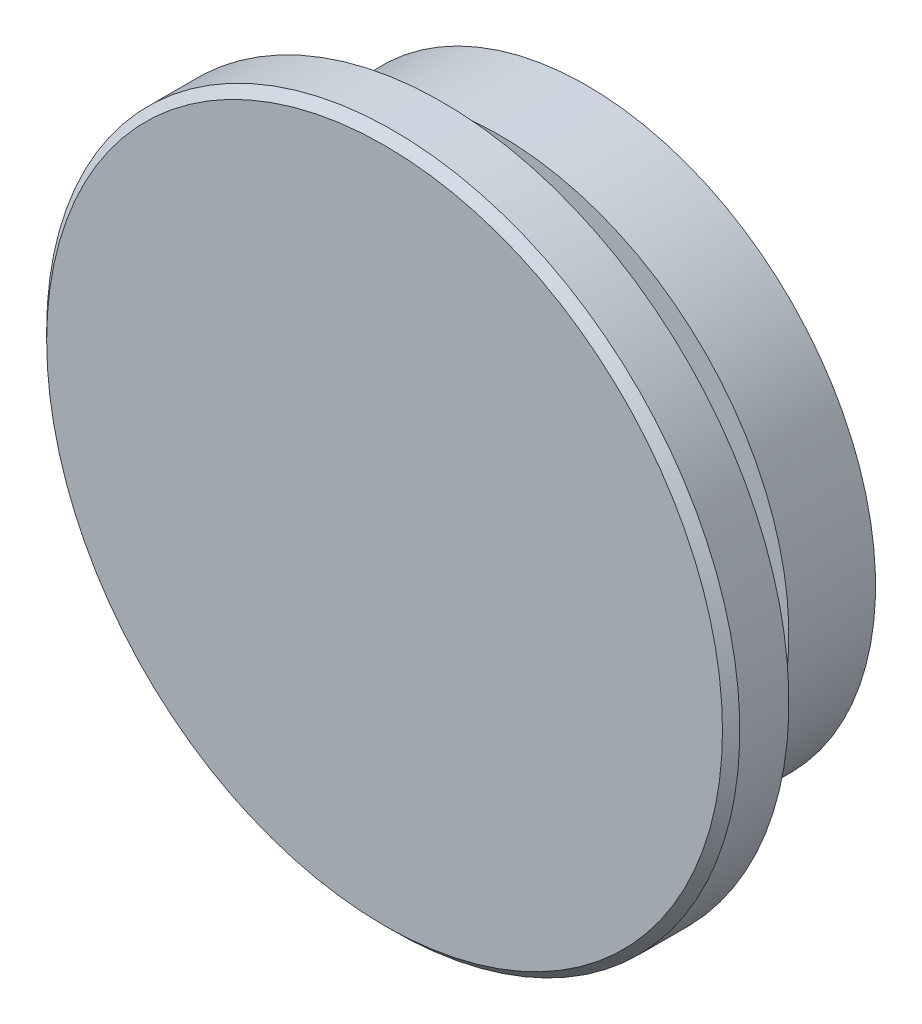
ISO-10303-21;
HEADER;
FILE_DESCRIPTION(('STEP AP214'),'2;1');
FILE_NAME('part.step','',(''),(''),'','','');
FILE_SCHEMA(('AUTOMOTIVE_DESIGN { 1 0 10303 214 1 1 1 1 }'));
ENDSEC;
DATA;
#1=APPLICATION_CONTEXT('core data for automotive mechanical design processes');
#2=APPLICATION_PROTOCOL_DEFINITION('international standard','automotive_design',2000,#1);
#3=PRODUCT_CONTEXT('',#1,'mechanical');
#4=PRODUCT('Part','Part','',(#3));
#5=PRODUCT_RELATED_PRODUCT_CATEGORY('part','',(#4));
#6=PRODUCT_DEFINITION_FORMATION('','',#4);
#7=PRODUCT_DEFINITION_CONTEXT('part definition',#1,'design');
#8=PRODUCT_DEFINITION('design','',#6,#7);
#9=PRODUCT_DEFINITION_SHAPE('','',#8);
#10=(LENGTH_UNIT() NAMED_UNIT(*) SI_UNIT(.MILLI.,.METRE.));
#11=(NAMED_UNIT(*) PLANE_ANGLE_UNIT() SI_UNIT($,.RADIAN.));
#12=(NAMED_UNIT(*) SI_UNIT($,.STERADIAN.) SOLID_ANGLE_UNIT());
#13=UNCERTAINTY_MEASURE_WITH_UNIT(LENGTH_MEASURE(1.E-05),#10,'distance_accuracy_value','');
#14=(GEOMETRIC_REPRESENTATION_CONTEXT(3) GLOBAL_UNCERTAINTY_ASSIGNED_CONTEXT((#13)) GLOBAL_UNIT_ASSIGNED_CONTEXT((#10,
#11,#12)) REPRESENTATION_CONTEXT('',''));
#15=CARTESIAN_POINT('',(0.,0.,0.));
#16=DIRECTION('',(0.,0.,1.));
#17=DIRECTION('',(1.,0.,0.));
#18=AXIS2_PLACEMENT_3D('',#15,#16,#17);
#19=CARTESIAN_POINT('',(0.,0.,0.));
#20=DIRECTION('',(0.,0.,1.));
#21=DIRECTION('',(1.,0.,0.));
#22=AXIS2_PLACEMENT_3D('',#19,#20,#21);
#23=PLANE('',#22);
#24=CARTESIAN_POINT('',(0.,0.,0.));
#25=DIRECTION('',(0.,0.,-1.));
#26=DIRECTION('',(-1.,0.,0.));
#27=AXIS2_PLACEMENT_3D('',#24,#25,#26);
#28=CIRCLE('',#27,11.7);
#29=CARTESIAN_POINT('',(-11.7,0.,0.));
#30=VERTEX_POINT('',#29);
#31=EDGE_CURVE('E10',#30,#30,#28,.T.);
#32=ORIENTED_EDGE('',*,*,#31,.F.);
#33=EDGE_LOOP('',(#32));
#34=FACE_BOUND('',#33,.T.);
#35=ADVANCED_FACE('F30',(#34),#23,.T.);
#36=CARTESIAN_POINT('',(0.,0.,-0.299999999999998));
#37=DIRECTION('',(0.,0.,-1.));
#38=DIRECTION('',(-1.,0.,0.));
#39=AXIS2_PLACEMENT_3D('',#36,#37,#38);
#40=CONICAL_SURFACE('',#39,12.,0.785398163397448);
#41=ORIENTED_EDGE('',*,*,#31,.T.);
#42=EDGE_LOOP('',(#41));
#43=FACE_BOUND('',#42,.T.);
#44=CARTESIAN_POINT('',(0.,0.,-0.299999999999998));
#45=DIRECTION('',(0.,0.,-1.));
#46=DIRECTION('',(-1.,0.,0.));
#47=AXIS2_PLACEMENT_3D('',#44,#45,#46);
#48=CIRCLE('',#47,12.);
#49=CARTESIAN_POINT('',(-12.,0.,-0.299999999999998));
#50=VERTEX_POINT('',#49);
#51=EDGE_CURVE('E36',#50,#50,#48,.T.);
#52=ORIENTED_EDGE('',*,*,#51,.F.);
#53=EDGE_LOOP('',(#52));
#54=FACE_BOUND('',#53,.T.);
#55=ADVANCED_FACE('F81',(#43,#54),#40,.T.);
#56=CARTESIAN_POINT('',(0.,0.,-5.5));
#57=DIRECTION('',(0.,0.,-1.));
#58=DIRECTION('',(-1.,0.,0.));
#59=AXIS2_PLACEMENT_3D('',#56,#57,#58);
#60=CYLINDRICAL_SURFACE('',#59,12.);
#61=ORIENTED_EDGE('',*,*,#51,.T.);
#62=EDGE_LOOP('',(#61));
#63=FACE_BOUND('',#62,.T.);
#64=CARTESIAN_POINT('',(0.,0.,-2.));
#65=DIRECTION('',(0.,0.,-1.));
#66=DIRECTION('',(-1.,0.,0.));
#67=AXIS2_PLACEMENT_3D('',#64,#65,#66);
#68=CIRCLE('',#67,12.);
#69=CARTESIAN_POINT('',(-12.,0.,-2.));
#70=VERTEX_POINT('',#69);
#71=EDGE_CURVE('E40',#70,#70,#68,.T.);
#72=ORIENTED_EDGE('',*,*,#71,.F.);
#73=EDGE_LOOP('',(#72));
#74=FACE_BOUND('',#73,.T.);
#75=ADVANCED_FACE('F86',(#63,#74),#60,.T.);
#76=CARTESIAN_POINT('',(-12.,0.,-2.));
#77=DIRECTION('',(0.,0.,-1.));
#78=DIRECTION('',(-1.,0.,0.));
#79=AXIS2_PLACEMENT_3D('',#76,#77,#78);
#80=PLANE('',#79);
#81=ORIENTED_EDGE('',*,*,#71,.T.);
#82=EDGE_LOOP('',(#81));
#83=FACE_BOUND('',#82,.T.);
#84=CARTESIAN_POINT('',(0.,0.,-2.));
#85=DIRECTION('',(0.,0.,-1.));
#86=DIRECTION('',(-1.,0.,0.));
#87=AXIS2_PLACEMENT_3D('',#84,#85,#86);
#88=CIRCLE('',#87,9.);
#89=CARTESIAN_POINT('',(-9.,0.,-2.));
#90=VERTEX_POINT('',#89);
#91=EDGE_CURVE('E44',#90,#90,#88,.T.);
#92=ORIENTED_EDGE('',*,*,#91,.F.);
#93=EDGE_LOOP('',(#92));
#94=FACE_BOUND('',#93,.T.);
#95=ADVANCED_FACE('F90',(#83,#94),#80,.T.);
#96=CARTESIAN_POINT('',(0.,0.,-5.5));
#97=DIRECTION('',(0.,0.,-1.));
#98=DIRECTION('',(-1.,0.,0.));
#99=AXIS2_PLACEMENT_3D('',#96,#97,#98);
#100=CYLINDRICAL_SURFACE('',#99,9.);
#101=ORIENTED_EDGE('',*,*,#91,.T.);
#102=EDGE_LOOP('',(#101));
#103=FACE_BOUND('',#102,.T.);
#104=CARTESIAN_POINT('',(0.,0.,-4.));
#105=DIRECTION('',(0.,0.,-1.));
#106=DIRECTION('',(-1.,0.,0.));
#107=AXIS2_PLACEMENT_3D('',#104,#105,#106);
#108=CIRCLE('',#107,9.);
#109=CARTESIAN_POINT('',(-9.,0.,-4.));
#110=VERTEX_POINT('',#109);
#111=EDGE_CURVE('E49',#110,#110,#108,.T.);
#112=ORIENTED_EDGE('',*,*,#111,.F.);
#113=EDGE_LOOP('',(#112));
#114=FACE_BOUND('',#113,.T.);
#115=ADVANCED_FACE('F96',(#103,#114),#100,.T.);
#116=CARTESIAN_POINT('',(-9.,0.,-4.));
#117=DIRECTION('',(0.,0.,1.));
#118=DIRECTION('',(1.,0.,0.));
#119=AXIS2_PLACEMENT_3D('',#116,#117,#118);
#120=PLANE('',#119);
#121=ORIENTED_EDGE('',*,*,#111,.T.);
#122=EDGE_LOOP('',(#121));
#123=FACE_BOUND('',#122,.T.);
#124=CARTESIAN_POINT('',(0.,0.,-4.));
#125=DIRECTION('',(0.,0.,-1.));
#126=DIRECTION('',(-1.,0.,0.));
#127=AXIS2_PLACEMENT_3D('',#124,#125,#126);
#128=CIRCLE('',#127,10.);
#129=CARTESIAN_POINT('',(-10.,0.,-4.));
#130=VERTEX_POINT('',#129);
#131=EDGE_CURVE('E52',#130,#130,#128,.T.);
#132=ORIENTED_EDGE('',*,*,#131,.F.);
#133=EDGE_LOOP('',(#132));
#134=FACE_BOUND('',#133,.T.);
#135=ADVANCED_FACE('F100',(#123,#134),#120,.T.);
#136=CARTESIAN_POINT('',(0.,0.,-5.5));
#137=DIRECTION('',(0.,0.,-1.));
#138=DIRECTION('',(-1.,0.,0.));
#139=AXIS2_PLACEMENT_3D('',#136,#137,#138);
#140=CYLINDRICAL_SURFACE('',#139,10.);
#141=ORIENTED_EDGE('',*,*,#131,.T.);
#142=EDGE_LOOP('',(#141));
#143=FACE_BOUND('',#142,.T.);
#144=CARTESIAN_POINT('',(0.,0.,-7.));
#145=DIRECTION('',(0.,0.,-1.));
#146=DIRECTION('',(-1.,0.,0.));
#147=AXIS2_PLACEMENT_3D('',#144,#145,#146);
#148=CIRCLE('',#147,10.);
#149=CARTESIAN_POINT('',(-10.,0.,-7.));
#150=VERTEX_POINT('',#149);
#151=EDGE_CURVE('E55',#150,#150,#148,.T.);
#152=ORIENTED_EDGE('',*,*,#151,.F.);
#153=EDGE_LOOP('',(#152));
#154=FACE_BOUND('',#153,.T.);
#155=ADVANCED_FACE('F77',(#143,#154),#140,.T.);
#156=CARTESIAN_POINT('',(-10.,0.,-7.));
#157=DIRECTION('',(0.,0.,-1.));
#158=DIRECTION('',(-1.,0.,0.));
#159=AXIS2_PLACEMENT_3D('',#156,#157,#158);
#160=PLANE('',#159);
#161=ORIENTED_EDGE('',*,*,#151,.T.);
#162=EDGE_LOOP('',(#161));
#163=FACE_BOUND('',#162,.T.);
#164=CARTESIAN_POINT('',(0.,0.,-7.));
#165=DIRECTION('',(0.,0.,-1.));
#166=DIRECTION('',(-1.,0.,0.));
#167=AXIS2_PLACEMENT_3D('',#164,#165,#166);
#168=CIRCLE('',#167,7.5);
#169=CARTESIAN_POINT('',(-7.5,0.,-7.));
#170=VERTEX_POINT('',#169);
#171=EDGE_CURVE('E58',#170,#170,#168,.T.);
#172=ORIENTED_EDGE('',*,*,#171,.F.);
#173=EDGE_LOOP('',(#172));
#174=FACE_BOUND('',#173,.T.);
#175=ADVANCED_FACE('F69',(#163,#174),#160,.T.);
#176=CARTESIAN_POINT('',(0.,0.,-5.5));
#177=DIRECTION('',(0.,0.,-1.));
#178=DIRECTION('',(-1.,0.,0.));
#179=AXIS2_PLACEMENT_3D('',#176,#177,#178);
#180=CYLINDRICAL_SURFACE('',#179,7.5);
#181=ORIENTED_EDGE('',*,*,#171,.T.);
#182=EDGE_LOOP('',(#181));
#183=FACE_BOUND('',#182,.T.);
#184=CARTESIAN_POINT('',(0.,0.,-5.5));
#185=DIRECTION('',(0.,0.,-1.));
#186=DIRECTION('',(-1.,0.,0.));
#187=AXIS2_PLACEMENT_3D('',#184,#185,#186);
#188=CIRCLE('',#187,7.5);
#189=CARTESIAN_POINT('',(-7.5,0.,-5.5));
#190=VERTEX_POINT('',#189);
#191=EDGE_CURVE('E61',#190,#190,#188,.T.);
#192=ORIENTED_EDGE('',*,*,#191,.F.);
#193=EDGE_LOOP('',(#192));
#194=FACE_BOUND('',#193,.T.);
#195=ADVANCED_FACE('F67',(#183,#194),#180,.F.);
#196=CARTESIAN_POINT('',(-7.5,0.,-5.5));
#197=DIRECTION('',(0.,0.,-1.));
#198=DIRECTION('',(-1.,0.,0.));
#199=AXIS2_PLACEMENT_3D('',#196,#197,#198);
#200=PLANE('',#199);
#201=ORIENTED_EDGE('',*,*,#191,.T.);
#202=EDGE_LOOP('',(#201));
#203=FACE_BOUND('',#202,.T.);
#204=ADVANCED_FACE('F65',(#203),#200,.T.);
#205=CLOSED_SHELL('',(#35,#55,#75,#95,#115,#135,#155,#175,#195,#204));
#206=MANIFOLD_SOLID_BREP('B2',#205);
#207=ADVANCED_BREP_SHAPE_REPRESENTATION('',(#18,#206),#14);
#208=SHAPE_DEFINITION_REPRESENTATION(#9,#207);
ENDSEC;
END-ISO-10303-21;
